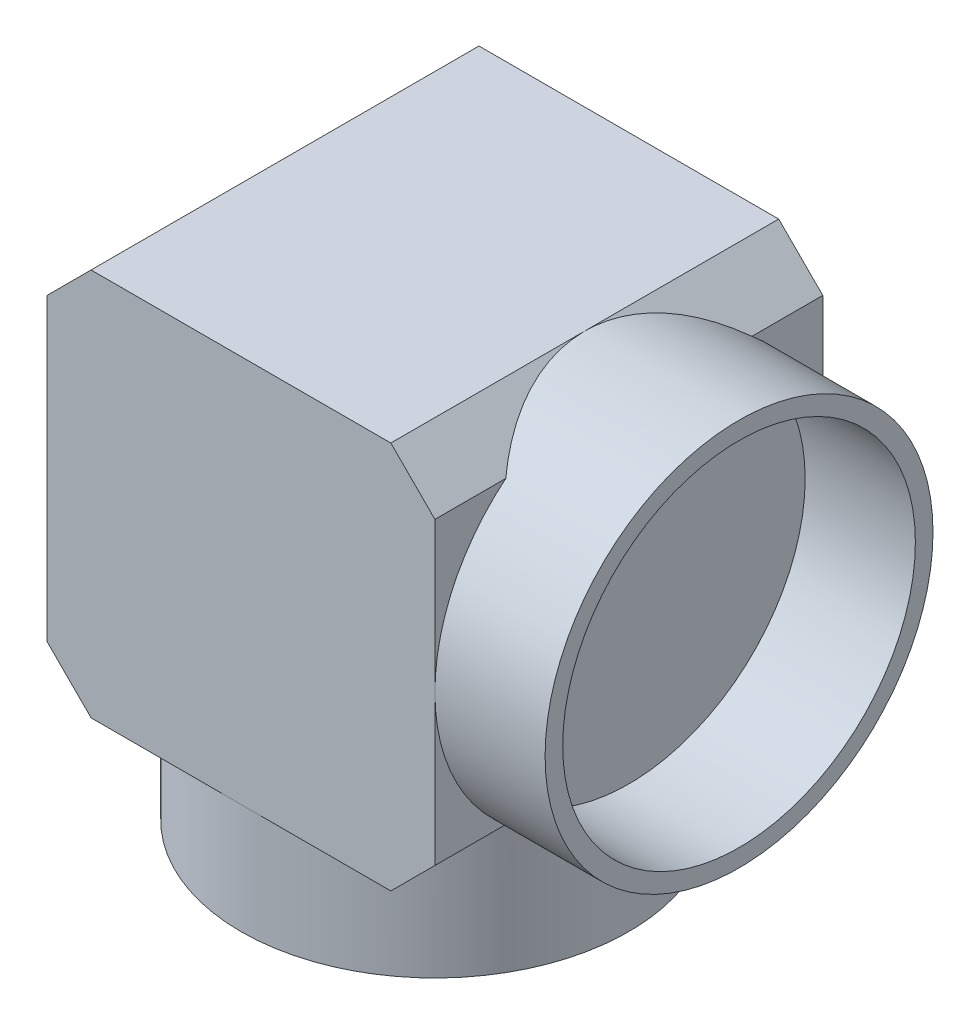
ISO-10303-21;
HEADER;
FILE_DESCRIPTION(('STEP AP214'),'2;1');
FILE_NAME('part.step','',(''),(''),'','','');
FILE_SCHEMA(('AUTOMOTIVE_DESIGN { 1 0 10303 214 1 1 1 1 }'));
ENDSEC;
DATA;
#1=APPLICATION_CONTEXT('core data for automotive mechanical design processes');
#2=APPLICATION_PROTOCOL_DEFINITION('international standard','automotive_design',2000,#1);
#3=PRODUCT_CONTEXT('',#1,'mechanical');
#4=PRODUCT('Part','Part','',(#3));
#5=PRODUCT_RELATED_PRODUCT_CATEGORY('part','',(#4));
#6=PRODUCT_DEFINITION_FORMATION('','',#4);
#7=PRODUCT_DEFINITION_CONTEXT('part definition',#1,'design');
#8=PRODUCT_DEFINITION('design','',#6,#7);
#9=PRODUCT_DEFINITION_SHAPE('','',#8);
#10=(LENGTH_UNIT() NAMED_UNIT(*) SI_UNIT(.MILLI.,.METRE.));
#11=(NAMED_UNIT(*) PLANE_ANGLE_UNIT() SI_UNIT($,.RADIAN.));
#12=(NAMED_UNIT(*) SI_UNIT($,.STERADIAN.) SOLID_ANGLE_UNIT());
#13=UNCERTAINTY_MEASURE_WITH_UNIT(LENGTH_MEASURE(1.E-05),#10,'distance_accuracy_value','');
#14=(GEOMETRIC_REPRESENTATION_CONTEXT(3) GLOBAL_UNCERTAINTY_ASSIGNED_CONTEXT((#13)) GLOBAL_UNIT_ASSIGNED_CONTEXT((#10,
#11,#12)) REPRESENTATION_CONTEXT('',''));
#15=CARTESIAN_POINT('',(0.,0.,0.));
#16=DIRECTION('',(0.,0.,1.));
#17=DIRECTION('',(1.,0.,0.));
#18=AXIS2_PLACEMENT_3D('',#15,#16,#17);
#19=CARTESIAN_POINT('',(44.,113.,44.));
#20=DIRECTION('',(-1.,0.,0.));
#21=DIRECTION('',(0.,0.,1.));
#22=AXIS2_PLACEMENT_3D('',#19,#20,#21);
#23=PLANE('',#22);
#24=DIRECTION('',(0.,-1.,0.));
#25=VECTOR('',#24,1.);
#26=CARTESIAN_POINT('',(44.,113.,44.));
#27=LINE('',#26,#25);
#28=CARTESIAN_POINT('',(44.,69.,44.));
#29=VERTEX_POINT('',#28);
#30=CARTESIAN_POINT('',(44.,35.0000000000002,44.));
#31=VERTEX_POINT('',#30);
#32=EDGE_CURVE('E170',#29,#31,#27,.T.);
#33=ORIENTED_EDGE('',*,*,#32,.T.);
#34=DIRECTION('',(0.,0.,-1.));
#35=VECTOR('',#34,1.);
#36=CARTESIAN_POINT('',(44.,35.0000000000002,44.));
#37=LINE('',#36,#35);
#38=CARTESIAN_POINT('',(44.,35.0000000000002,27.9284800875381));
#39=VERTEX_POINT('',#38);
#40=EDGE_CURVE('E181',#31,#39,#37,.T.);
#41=ORIENTED_EDGE('',*,*,#40,.T.);
#42=CARTESIAN_POINT('',(44.,69.,0.));
#43=DIRECTION('',(1.,0.,0.));
#44=DIRECTION('',(0.,0.,-1.));
#45=AXIS2_PLACEMENT_3D('',#42,#43,#44);
#46=CIRCLE('',#45,44.);
#47=EDGE_CURVE('E154',#29,#39,#46,.T.);
#48=ORIENTED_EDGE('',*,*,#47,.F.);
#49=EDGE_LOOP('',(#33,#41,#48));
#50=FACE_BOUND('',#49,.T.);
#51=ADVANCED_FACE('F41',(#50),#23,.F.);
#52=CARTESIAN_POINT('',(44.,35.0000000000002,-27.9284800875381));
#53=VERTEX_POINT('',#52);
#54=CARTESIAN_POINT('',(44.,69.,-44.));
#55=VERTEX_POINT('',#54);
#56=EDGE_CURVE('E161',#53,#55,#46,.T.);
#57=ORIENTED_EDGE('',*,*,#56,.F.);
#58=DIRECTION('',(0.,0.,-1.));
#59=VECTOR('',#58,1.);
#60=CARTESIAN_POINT('',(44.,35.0000000000002,44.));
#61=LINE('',#60,#59);
#62=CARTESIAN_POINT('',(44.,35.0000000000002,-44.));
#63=VERTEX_POINT('',#62);
#64=EDGE_CURVE('E337',#53,#63,#61,.T.);
#65=ORIENTED_EDGE('',*,*,#64,.T.);
#66=DIRECTION('',(0.,-1.,0.));
#67=VECTOR('',#66,1.);
#68=CARTESIAN_POINT('',(44.,113.,-44.));
#69=LINE('',#68,#67);
#70=EDGE_CURVE('E261',#55,#63,#69,.T.);
#71=ORIENTED_EDGE('',*,*,#70,.F.);
#72=EDGE_LOOP('',(#57,#65,#71));
#73=FACE_BOUND('',#72,.T.);
#74=ADVANCED_FACE('F220',(#73),#23,.F.);
#75=CARTESIAN_POINT('',(44.,103.,-44.));
#76=VERTEX_POINT('',#75);
#77=EDGE_CURVE('E180',#76,#55,#69,.T.);
#78=ORIENTED_EDGE('',*,*,#77,.F.);
#79=DIRECTION('',(0.,0.,1.));
#80=VECTOR('',#79,1.);
#81=CARTESIAN_POINT('',(44.,103.,0.));
#82=LINE('',#81,#80);
#83=CARTESIAN_POINT('',(44.,103.,-27.928480087538));
#84=VERTEX_POINT('',#83);
#85=EDGE_CURVE('E258',#76,#84,#82,.T.);
#86=ORIENTED_EDGE('',*,*,#85,.T.);
#87=EDGE_CURVE('E159',#55,#84,#46,.T.);
#88=ORIENTED_EDGE('',*,*,#87,.F.);
#89=EDGE_LOOP('',(#78,#86,#88));
#90=FACE_BOUND('',#89,.T.);
#91=ADVANCED_FACE('F225',(#90),#23,.F.);
#92=CARTESIAN_POINT('',(0.,0.,0.));
#93=DIRECTION('',(0.,1.,0.));
#94=DIRECTION('',(0.,0.,1.));
#95=AXIS2_PLACEMENT_3D('',#92,#93,#94);
#96=PLANE('',#95);
#97=CARTESIAN_POINT('',(0.,0.,0.));
#98=DIRECTION('',(0.,1.,0.));
#99=DIRECTION('',(0.,0.,1.));
#100=AXIS2_PLACEMENT_3D('',#97,#98,#99);
#101=CIRCLE('',#100,44.);
#102=CARTESIAN_POINT('',(0.,0.,44.));
#103=VERTEX_POINT('',#102);
#104=EDGE_CURVE('E319',#103,#103,#101,.T.);
#105=ORIENTED_EDGE('',*,*,#104,.F.);
#106=EDGE_LOOP('',(#105));
#107=FACE_BOUND('',#106,.T.);
#108=CARTESIAN_POINT('',(0.,0.,0.));
#109=DIRECTION('',(0.,1.,0.));
#110=DIRECTION('',(0.,0.,1.));
#111=AXIS2_PLACEMENT_3D('',#108,#109,#110);
#112=CIRCLE('',#111,40.);
#113=CARTESIAN_POINT('',(0.,0.,40.));
#114=VERTEX_POINT('',#113);
#115=EDGE_CURVE('E316',#114,#114,#112,.T.);
#116=ORIENTED_EDGE('',*,*,#115,.T.);
#117=EDGE_LOOP('',(#116));
#118=FACE_BOUND('',#117,.T.);
#119=ADVANCED_FACE('F248',(#107,#118),#96,.F.);
#120=CARTESIAN_POINT('',(0.,25.,0.));
#121=DIRECTION('',(0.,-1.,0.));
#122=DIRECTION('',(0.,0.,-1.));
#123=AXIS2_PLACEMENT_3D('',#120,#121,#122);
#124=CYLINDRICAL_SURFACE('',#123,44.);
#125=CARTESIAN_POINT('',(0.,25.,0.));
#126=DIRECTION('',(0.,1.,0.));
#127=DIRECTION('',(0.,0.,1.));
#128=AXIS2_PLACEMENT_3D('',#125,#126,#127);
#129=CIRCLE('',#128,44.);
#130=CARTESIAN_POINT('',(33.9999999999999,25.,-27.928480087538));
#131=VERTEX_POINT('',#130);
#132=CARTESIAN_POINT('',(0.,25.,-44.));
#133=VERTEX_POINT('',#132);
#134=EDGE_CURVE('E324',#131,#133,#129,.T.);
#135=ORIENTED_EDGE('',*,*,#134,.F.);
#136=CARTESIAN_POINT('',(0.,-9.00000000000025,0.));
#137=DIRECTION('',(-0.707106781186551,0.707106781186544,0.));
#138=DIRECTION('',(-0.707106781186544,-0.707106781186551,0.));
#139=AXIS2_PLACEMENT_3D('',#136,#137,#138);
#140=ELLIPSE('',#139,62.2253967444165,44.);
#141=CARTESIAN_POINT('',(38.9999999999999,30.0000000000001,-20.3715487874635));
#142=VERTEX_POINT('',#141);
#143=EDGE_CURVE('E279',#131,#142,#140,.F.);
#144=ORIENTED_EDGE('',*,*,#143,.T.);
#145=CARTESIAN_POINT('',(0.,69.,0.));
#146=DIRECTION('',(-0.707106781186547,-0.707106781186547,0.));
#147=DIRECTION('',(-0.707106781186547,0.707106781186547,0.));
#148=AXIS2_PLACEMENT_3D('',#145,#146,#147);
#149=ELLIPSE('',#148,62.2253967444162,44.);
#150=CARTESIAN_POINT('',(38.9999999999999,30.0000000000001,20.3715487874635));
#151=VERTEX_POINT('',#150);
#152=EDGE_CURVE('E11',#142,#151,#149,.T.);
#153=ORIENTED_EDGE('',*,*,#152,.T.);
#154=CARTESIAN_POINT('',(0.,-9.00000000000025,0.));
#155=DIRECTION('',(-0.707106781186551,0.707106781186544,0.));
#156=DIRECTION('',(-0.707106781186544,-0.707106781186551,0.));
#157=AXIS2_PLACEMENT_3D('',#154,#155,#156);
#158=ELLIPSE('',#157,62.2253967444165,44.);
#159=CARTESIAN_POINT('',(33.9999999999999,25.,27.928480087538));
#160=VERTEX_POINT('',#159);
#161=EDGE_CURVE('E277',#151,#160,#158,.F.);
#162=ORIENTED_EDGE('',*,*,#161,.T.);
#163=CARTESIAN_POINT('',(0.,25.,44.));
#164=VERTEX_POINT('',#163);
#165=EDGE_CURVE('E323',#164,#160,#129,.T.);
#166=ORIENTED_EDGE('',*,*,#165,.F.);
#167=CARTESIAN_POINT('',(-33.9999999999999,25.,27.928480087538));
#168=VERTEX_POINT('',#167);
#169=EDGE_CURVE('E320',#168,#164,#129,.T.);
#170=ORIENTED_EDGE('',*,*,#169,.F.);
#171=CARTESIAN_POINT('',(0.,-9.00000000000025,0.));
#172=DIRECTION('',(0.707106781186551,0.707106781186544,0.));
#173=DIRECTION('',(0.707106781186544,-0.707106781186551,0.));
#174=AXIS2_PLACEMENT_3D('',#171,#172,#173);
#175=ELLIPSE('',#174,62.2253967444165,44.);
#176=CARTESIAN_POINT('',(-44.,35.0000000000002,0.));
#177=VERTEX_POINT('',#176);
#178=EDGE_CURVE('E283',#168,#177,#175,.F.);
#179=ORIENTED_EDGE('',*,*,#178,.T.);
#180=CARTESIAN_POINT('',(0.,-9.00000000000025,0.));
#181=DIRECTION('',(0.707106781186551,0.707106781186544,0.));
#182=DIRECTION('',(0.707106781186544,-0.707106781186551,0.));
#183=AXIS2_PLACEMENT_3D('',#180,#181,#182);
#184=ELLIPSE('',#183,62.2253967444165,44.);
#185=CARTESIAN_POINT('',(-33.9999999999999,25.,-27.928480087538));
#186=VERTEX_POINT('',#185);
#187=EDGE_CURVE('E286',#177,#186,#184,.F.);
#188=ORIENTED_EDGE('',*,*,#187,.T.);
#189=EDGE_CURVE('E322',#133,#186,#129,.T.);
#190=ORIENTED_EDGE('',*,*,#189,.F.);
#191=EDGE_LOOP('',(#135,#144,#153,#162,#166,#170,#179,#188,#190));
#192=FACE_BOUND('',#191,.T.);
#193=ORIENTED_EDGE('',*,*,#104,.T.);
#194=EDGE_LOOP('',(#193));
#195=FACE_BOUND('',#194,.T.);
#196=ADVANCED_FACE('F253',(#192,#195),#124,.T.);
#197=CARTESIAN_POINT('',(0.,25.,0.));
#198=DIRECTION('',(0.,-1.,0.));
#199=DIRECTION('',(0.,0.,-1.));
#200=AXIS2_PLACEMENT_3D('',#197,#198,#199);
#201=CYLINDRICAL_SURFACE('',#200,40.);
#202=CARTESIAN_POINT('',(0.,25.,0.));
#203=DIRECTION('',(0.,1.,0.));
#204=DIRECTION('',(0.,0.,1.));
#205=AXIS2_PLACEMENT_3D('',#202,#203,#204);
#206=CIRCLE('',#205,40.);
#207=CARTESIAN_POINT('',(0.,25.,40.));
#208=VERTEX_POINT('',#207);
#209=EDGE_CURVE('E313',#208,#208,#206,.T.);
#210=ORIENTED_EDGE('',*,*,#209,.T.);
#211=EDGE_LOOP('',(#210));
#212=FACE_BOUND('',#211,.T.);
#213=ORIENTED_EDGE('',*,*,#115,.F.);
#214=EDGE_LOOP('',(#213));
#215=FACE_BOUND('',#214,.T.);
#216=ADVANCED_FACE('F399',(#212,#215),#201,.F.);
#217=CARTESIAN_POINT('',(0.,25.,0.));
#218=DIRECTION('',(0.,1.,0.));
#219=DIRECTION('',(0.,0.,1.));
#220=AXIS2_PLACEMENT_3D('',#217,#218,#219);
#221=PLANE('',#220);
#222=ORIENTED_EDGE('',*,*,#209,.F.);
#223=EDGE_LOOP('',(#222));
#224=FACE_BOUND('',#223,.T.);
#225=ADVANCED_FACE('F404',(#224),#221,.F.);
#226=DIRECTION('',(-1.,0.,0.));
#227=VECTOR('',#226,1.);
#228=CARTESIAN_POINT('',(44.,25.,-44.));
#229=LINE('',#228,#227);
#230=CARTESIAN_POINT('',(33.9999999999999,25.,-44.));
#231=VERTEX_POINT('',#230);
#232=EDGE_CURVE('E305',#231,#133,#229,.T.);
#233=ORIENTED_EDGE('',*,*,#232,.F.);
#234=DIRECTION('',(0.,0.,1.));
#235=VECTOR('',#234,1.);
#236=CARTESIAN_POINT('',(33.9999999999999,25.,0.));
#237=LINE('',#236,#235);
#238=EDGE_CURVE('E346',#231,#131,#237,.T.);
#239=ORIENTED_EDGE('',*,*,#238,.T.);
#240=ORIENTED_EDGE('',*,*,#134,.T.);
#241=EDGE_LOOP('',(#233,#239,#240));
#242=FACE_BOUND('',#241,.T.);
#243=ADVANCED_FACE('F421',(#242),#221,.F.);
#244=ORIENTED_EDGE('',*,*,#189,.T.);
#245=DIRECTION('',(0.,0.,-1.));
#246=VECTOR('',#245,1.);
#247=CARTESIAN_POINT('',(-33.9999999999999,25.,0.));
#248=LINE('',#247,#246);
#249=CARTESIAN_POINT('',(-33.9999999999999,25.,-44.));
#250=VERTEX_POINT('',#249);
#251=EDGE_CURVE('E357',#186,#250,#248,.T.);
#252=ORIENTED_EDGE('',*,*,#251,.T.);
#253=EDGE_CURVE('E308',#133,#250,#229,.T.);
#254=ORIENTED_EDGE('',*,*,#253,.F.);
#255=EDGE_LOOP('',(#244,#252,#254));
#256=FACE_BOUND('',#255,.T.);
#257=ADVANCED_FACE('F417',(#256),#221,.F.);
#258=DIRECTION('',(1.,0.,0.));
#259=VECTOR('',#258,1.);
#260=CARTESIAN_POINT('',(44.,25.,44.));
#261=LINE('',#260,#259);
#262=CARTESIAN_POINT('',(-33.9999999999999,25.,44.));
#263=VERTEX_POINT('',#262);
#264=EDGE_CURVE('E193',#263,#164,#261,.T.);
#265=ORIENTED_EDGE('',*,*,#264,.F.);
#266=DIRECTION('',(0.,0.,-1.));
#267=VECTOR('',#266,1.);
#268=CARTESIAN_POINT('',(-33.9999999999999,25.,0.));
#269=LINE('',#268,#267);
#270=EDGE_CURVE('E355',#263,#168,#269,.T.);
#271=ORIENTED_EDGE('',*,*,#270,.T.);
#272=ORIENTED_EDGE('',*,*,#169,.T.);
#273=EDGE_LOOP('',(#265,#271,#272));
#274=FACE_BOUND('',#273,.T.);
#275=ADVANCED_FACE('F411',(#274),#221,.F.);
#276=ORIENTED_EDGE('',*,*,#165,.T.);
#277=DIRECTION('',(0.,0.,1.));
#278=VECTOR('',#277,1.);
#279=CARTESIAN_POINT('',(33.9999999999999,25.,0.));
#280=LINE('',#279,#278);
#281=CARTESIAN_POINT('',(33.9999999999999,25.,44.));
#282=VERTEX_POINT('',#281);
#283=EDGE_CURVE('E328',#160,#282,#280,.T.);
#284=ORIENTED_EDGE('',*,*,#283,.T.);
#285=EDGE_CURVE('E190',#164,#282,#261,.T.);
#286=ORIENTED_EDGE('',*,*,#285,.F.);
#287=EDGE_LOOP('',(#276,#284,#286));
#288=FACE_BOUND('',#287,.T.);
#289=ADVANCED_FACE('F407',(#288),#221,.F.);
#290=CARTESIAN_POINT('',(-44.,113.,44.));
#291=DIRECTION('',(1.,0.,0.));
#292=DIRECTION('',(0.,0.,-1.));
#293=AXIS2_PLACEMENT_3D('',#290,#291,#292);
#294=PLANE('',#293);
#295=DIRECTION('',(0.,0.,1.));
#296=VECTOR('',#295,1.);
#297=CARTESIAN_POINT('',(-44.,35.0000000000002,44.));
#298=LINE('',#297,#296);
#299=CARTESIAN_POINT('',(-44.,35.0000000000002,-44.));
#300=VERTEX_POINT('',#299);
#301=EDGE_CURVE('E350',#300,#177,#298,.T.);
#302=ORIENTED_EDGE('',*,*,#301,.T.);
#303=DIRECTION('',(0.,0.,1.));
#304=VECTOR('',#303,1.);
#305=CARTESIAN_POINT('',(-44.,35.0000000000002,44.));
#306=LINE('',#305,#304);
#307=CARTESIAN_POINT('',(-44.,35.0000000000002,44.));
#308=VERTEX_POINT('',#307);
#309=EDGE_CURVE('E352',#177,#308,#306,.T.);
#310=ORIENTED_EDGE('',*,*,#309,.T.);
#311=DIRECTION('',(0.,-1.,0.));
#312=VECTOR('',#311,1.);
#313=CARTESIAN_POINT('',(-44.,113.,44.));
#314=LINE('',#313,#312);
#315=CARTESIAN_POINT('',(-44.,103.,44.));
#316=VERTEX_POINT('',#315);
#317=EDGE_CURVE('E169',#316,#308,#314,.T.);
#318=ORIENTED_EDGE('',*,*,#317,.F.);
#319=DIRECTION('',(0.,0.,-1.));
#320=VECTOR('',#319,1.);
#321=CARTESIAN_POINT('',(-44.,103.,-44.));
#322=LINE('',#321,#320);
#323=CARTESIAN_POINT('',(-44.,103.,-44.));
#324=VERTEX_POINT('',#323);
#325=EDGE_CURVE('E348',#316,#324,#322,.T.);
#326=ORIENTED_EDGE('',*,*,#325,.T.);
#327=DIRECTION('',(0.,-1.,0.));
#328=VECTOR('',#327,1.);
#329=CARTESIAN_POINT('',(-44.,113.,-44.));
#330=LINE('',#329,#328);
#331=EDGE_CURVE('E300',#324,#300,#330,.T.);
#332=ORIENTED_EDGE('',*,*,#331,.T.);
#333=EDGE_LOOP('',(#302,#310,#318,#326,#332));
#334=FACE_BOUND('',#333,.T.);
#335=ADVANCED_FACE('F236',(#334),#294,.F.);
#336=CARTESIAN_POINT('',(44.,113.,44.));
#337=DIRECTION('',(0.,0.,-1.));
#338=DIRECTION('',(-1.,0.,0.));
#339=AXIS2_PLACEMENT_3D('',#336,#337,#338);
#340=PLANE('',#339);
#341=ORIENTED_EDGE('',*,*,#285,.T.);
#342=DIRECTION('',(-0.707106781186544,-0.707106781186551,0.));
#343=VECTOR('',#342,1.);
#344=CARTESIAN_POINT('',(44.,35.0000000000002,44.));
#345=LINE('',#344,#343);
#346=EDGE_CURVE('E176',#282,#31,#345,.F.);
#347=ORIENTED_EDGE('',*,*,#346,.T.);
#348=ORIENTED_EDGE('',*,*,#32,.F.);
#349=CARTESIAN_POINT('',(44.,103.,44.));
#350=VERTEX_POINT('',#349);
#351=EDGE_CURVE('E163',#350,#29,#27,.T.);
#352=ORIENTED_EDGE('',*,*,#351,.F.);
#353=DIRECTION('',(-0.707106781186551,0.707106781186544,0.));
#354=VECTOR('',#353,1.);
#355=CARTESIAN_POINT('',(33.9999999999998,113.,44.));
#356=LINE('',#355,#354);
#357=CARTESIAN_POINT('',(33.9999999999998,113.,44.));
#358=VERTEX_POINT('',#357);
#359=EDGE_CURVE('E332',#350,#358,#356,.T.);
#360=ORIENTED_EDGE('',*,*,#359,.T.);
#361=DIRECTION('',(1.,0.,0.));
#362=VECTOR('',#361,1.);
#363=CARTESIAN_POINT('',(44.,113.,44.));
#364=LINE('',#363,#362);
#365=CARTESIAN_POINT('',(-34.,113.,44.));
#366=VERTEX_POINT('',#365);
#367=EDGE_CURVE('E301',#366,#358,#364,.T.);
#368=ORIENTED_EDGE('',*,*,#367,.F.);
#369=DIRECTION('',(-0.707106781186546,-0.707106781186549,0.));
#370=VECTOR('',#369,1.);
#371=CARTESIAN_POINT('',(-34.,113.,44.));
#372=LINE('',#371,#370);
#373=EDGE_CURVE('E330',#366,#316,#372,.T.);
#374=ORIENTED_EDGE('',*,*,#373,.T.);
#375=ORIENTED_EDGE('',*,*,#317,.T.);
#376=DIRECTION('',(-0.707106781186544,0.707106781186551,0.));
#377=VECTOR('',#376,1.);
#378=CARTESIAN_POINT('',(-44.,35.0000000000002,44.));
#379=LINE('',#378,#377);
#380=EDGE_CURVE('E334',#308,#263,#379,.F.);
#381=ORIENTED_EDGE('',*,*,#380,.T.);
#382=ORIENTED_EDGE('',*,*,#264,.T.);
#383=EDGE_LOOP('',(#341,#347,#348,#352,#360,#368,#374,#375,#381,#382));
#384=FACE_BOUND('',#383,.T.);
#385=ADVANCED_FACE('F174',(#384),#340,.F.);
#386=CARTESIAN_POINT('',(44.,103.,27.928480087538));
#387=VERTEX_POINT('',#386);
#388=EDGE_CURVE('E149',#387,#29,#46,.T.);
#389=ORIENTED_EDGE('',*,*,#388,.F.);
#390=DIRECTION('',(0.,0.,1.));
#391=VECTOR('',#390,1.);
#392=CARTESIAN_POINT('',(44.,103.,44.));
#393=LINE('',#392,#391);
#394=EDGE_CURVE('E166',#387,#350,#393,.T.);
#395=ORIENTED_EDGE('',*,*,#394,.T.);
#396=ORIENTED_EDGE('',*,*,#351,.T.);
#397=EDGE_LOOP('',(#389,#395,#396));
#398=FACE_BOUND('',#397,.T.);
#399=ADVANCED_FACE('F165',(#398),#23,.F.);
#400=CARTESIAN_POINT('',(44.,113.,-44.));
#401=DIRECTION('',(0.,0.,1.));
#402=DIRECTION('',(1.,0.,0.));
#403=AXIS2_PLACEMENT_3D('',#400,#401,#402);
#404=PLANE('',#403);
#405=ORIENTED_EDGE('',*,*,#70,.T.);
#406=DIRECTION('',(0.707106781186544,0.707106781186551,0.));
#407=VECTOR('',#406,1.);
#408=CARTESIAN_POINT('',(44.,35.0000000000002,-44.));
#409=LINE('',#408,#407);
#410=EDGE_CURVE('E344',#63,#231,#409,.F.);
#411=ORIENTED_EDGE('',*,*,#410,.T.);
#412=ORIENTED_EDGE('',*,*,#232,.T.);
#413=ORIENTED_EDGE('',*,*,#253,.T.);
#414=DIRECTION('',(0.707106781186544,-0.707106781186551,0.));
#415=VECTOR('',#414,1.);
#416=CARTESIAN_POINT('',(-44.,35.0000000000002,-44.));
#417=LINE('',#416,#415);
#418=EDGE_CURVE('E342',#250,#300,#417,.F.);
#419=ORIENTED_EDGE('',*,*,#418,.T.);
#420=ORIENTED_EDGE('',*,*,#331,.F.);
#421=DIRECTION('',(0.707106781186546,0.707106781186549,0.));
#422=VECTOR('',#421,1.);
#423=CARTESIAN_POINT('',(-34.,113.,-44.));
#424=LINE('',#423,#422);
#425=CARTESIAN_POINT('',(-34.,113.,-44.));
#426=VERTEX_POINT('',#425);
#427=EDGE_CURVE('E299',#324,#426,#424,.T.);
#428=ORIENTED_EDGE('',*,*,#427,.T.);
#429=DIRECTION('',(-1.,0.,0.));
#430=VECTOR('',#429,1.);
#431=CARTESIAN_POINT('',(44.,113.,-44.));
#432=LINE('',#431,#430);
#433=CARTESIAN_POINT('',(33.9999999999998,113.,-44.));
#434=VERTEX_POINT('',#433);
#435=EDGE_CURVE('E294',#434,#426,#432,.T.);
#436=ORIENTED_EDGE('',*,*,#435,.F.);
#437=DIRECTION('',(0.707106781186551,-0.707106781186544,0.));
#438=VECTOR('',#437,1.);
#439=CARTESIAN_POINT('',(33.9999999999998,113.,-44.));
#440=LINE('',#439,#438);
#441=EDGE_CURVE('E266',#434,#76,#440,.T.);
#442=ORIENTED_EDGE('',*,*,#441,.T.);
#443=ORIENTED_EDGE('',*,*,#77,.T.);
#444=EDGE_LOOP('',(#405,#411,#412,#413,#419,#420,#428,#436,#442,#443));
#445=FACE_BOUND('',#444,.T.);
#446=ADVANCED_FACE('F215',(#445),#404,.F.);
#447=CARTESIAN_POINT('',(0.,113.,0.));
#448=DIRECTION('',(0.,1.,0.));
#449=DIRECTION('',(0.,0.,1.));
#450=AXIS2_PLACEMENT_3D('',#447,#448,#449);
#451=PLANE('',#450);
#452=DIRECTION('',(0.,0.,-1.));
#453=VECTOR('',#452,1.);
#454=CARTESIAN_POINT('',(33.9999999999998,113.,0.));
#455=LINE('',#454,#453);
#456=CARTESIAN_POINT('',(33.9999999999998,113.,0.));
#457=VERTEX_POINT('',#456);
#458=EDGE_CURVE('E272',#358,#457,#455,.T.);
#459=ORIENTED_EDGE('',*,*,#458,.T.);
#460=DIRECTION('',(0.,0.,-1.));
#461=VECTOR('',#460,1.);
#462=CARTESIAN_POINT('',(33.9999999999998,113.,-44.));
#463=LINE('',#462,#461);
#464=EDGE_CURVE('E269',#457,#434,#463,.T.);
#465=ORIENTED_EDGE('',*,*,#464,.T.);
#466=ORIENTED_EDGE('',*,*,#435,.T.);
#467=DIRECTION('',(0.,0.,1.));
#468=VECTOR('',#467,1.);
#469=CARTESIAN_POINT('',(-34.,113.,44.));
#470=LINE('',#469,#468);
#471=EDGE_CURVE('E359',#426,#366,#470,.T.);
#472=ORIENTED_EDGE('',*,*,#471,.T.);
#473=ORIENTED_EDGE('',*,*,#367,.T.);
#474=EDGE_LOOP('',(#459,#465,#466,#472,#473));
#475=FACE_BOUND('',#474,.T.);
#476=ADVANCED_FACE('F207',(#475),#451,.T.);
#477=CARTESIAN_POINT('',(69.,69.,0.));
#478=DIRECTION('',(1.,0.,0.));
#479=DIRECTION('',(0.,0.,-1.));
#480=AXIS2_PLACEMENT_3D('',#477,#478,#479);
#481=PLANE('',#480);
#482=CARTESIAN_POINT('',(69.,69.,0.));
#483=DIRECTION('',(1.,0.,0.));
#484=DIRECTION('',(0.,0.,-1.));
#485=AXIS2_PLACEMENT_3D('',#482,#483,#484);
#486=CIRCLE('',#485,44.);
#487=CARTESIAN_POINT('',(69.,69.,-44.));
#488=VERTEX_POINT('',#487);
#489=EDGE_CURVE('E186',#488,#488,#486,.T.);
#490=ORIENTED_EDGE('',*,*,#489,.T.);
#491=EDGE_LOOP('',(#490));
#492=FACE_BOUND('',#491,.T.);
#493=CARTESIAN_POINT('',(69.,69.,0.));
#494=DIRECTION('',(1.,0.,0.));
#495=DIRECTION('',(0.,0.,-1.));
#496=AXIS2_PLACEMENT_3D('',#493,#494,#495);
#497=CIRCLE('',#496,40.);
#498=CARTESIAN_POINT('',(69.,69.,-40.));
#499=VERTEX_POINT('',#498);
#500=EDGE_CURVE('E183',#499,#499,#497,.T.);
#501=ORIENTED_EDGE('',*,*,#500,.F.);
#502=EDGE_LOOP('',(#501));
#503=FACE_BOUND('',#502,.T.);
#504=ADVANCED_FACE('F205',(#492,#503),#481,.T.);
#505=CARTESIAN_POINT('',(69.,69.,0.));
#506=DIRECTION('',(-1.,0.,0.));
#507=DIRECTION('',(0.,0.,1.));
#508=AXIS2_PLACEMENT_3D('',#505,#506,#507);
#509=CYLINDRICAL_SURFACE('',#508,44.);
#510=ORIENTED_EDGE('',*,*,#489,.F.);
#511=EDGE_LOOP('',(#510));
#512=FACE_BOUND('',#511,.T.);
#513=ORIENTED_EDGE('',*,*,#87,.T.);
#514=CARTESIAN_POINT('',(78.0000000000003,69.,0.));
#515=DIRECTION('',(0.707106781186544,0.707106781186551,0.));
#516=DIRECTION('',(-0.707106781186551,0.707106781186544,0.));
#517=AXIS2_PLACEMENT_3D('',#514,#515,#516);
#518=ELLIPSE('',#517,62.2253967444165,44.);
#519=EDGE_CURVE('E268',#84,#457,#518,.T.);
#520=ORIENTED_EDGE('',*,*,#519,.T.);
#521=CARTESIAN_POINT('',(78.0000000000003,69.,0.));
#522=DIRECTION('',(0.707106781186544,0.707106781186551,0.));
#523=DIRECTION('',(-0.707106781186551,0.707106781186544,0.));
#524=AXIS2_PLACEMENT_3D('',#521,#522,#523);
#525=ELLIPSE('',#524,62.2253967444165,44.);
#526=EDGE_CURVE('E50',#457,#387,#525,.T.);
#527=ORIENTED_EDGE('',*,*,#526,.T.);
#528=ORIENTED_EDGE('',*,*,#388,.T.);
#529=ORIENTED_EDGE('',*,*,#47,.T.);
#530=CARTESIAN_POINT('',(77.9999999999995,69.,0.));
#531=DIRECTION('',(-0.707106781186551,0.707106781186544,0.));
#532=DIRECTION('',(-0.707106781186544,-0.707106781186551,0.));
#533=AXIS2_PLACEMENT_3D('',#530,#531,#532);
#534=ELLIPSE('',#533,62.2253967444159,44.);
#535=EDGE_CURVE('E60',#39,#151,#534,.F.);
#536=ORIENTED_EDGE('',*,*,#535,.T.);
#537=ORIENTED_EDGE('',*,*,#152,.F.);
#538=CARTESIAN_POINT('',(77.9999999999995,69.,0.));
#539=DIRECTION('',(-0.707106781186551,0.707106781186544,0.));
#540=DIRECTION('',(-0.707106781186544,-0.707106781186551,0.));
#541=AXIS2_PLACEMENT_3D('',#538,#539,#540);
#542=ELLIPSE('',#541,62.2253967444159,44.);
#543=EDGE_CURVE('E281',#142,#53,#542,.F.);
#544=ORIENTED_EDGE('',*,*,#543,.T.);
#545=ORIENTED_EDGE('',*,*,#56,.T.);
#546=EDGE_LOOP('',(#513,#520,#527,#528,#529,#536,#537,#544,#545));
#547=FACE_BOUND('',#546,.T.);
#548=ADVANCED_FACE('F152',(#512,#547),#509,.T.);
#549=CARTESIAN_POINT('',(69.,69.,0.));
#550=DIRECTION('',(-1.,0.,0.));
#551=DIRECTION('',(0.,0.,1.));
#552=AXIS2_PLACEMENT_3D('',#549,#550,#551);
#553=CYLINDRICAL_SURFACE('',#552,40.);
#554=ORIENTED_EDGE('',*,*,#500,.T.);
#555=EDGE_LOOP('',(#554));
#556=FACE_BOUND('',#555,.T.);
#557=CARTESIAN_POINT('',(44.,69.,0.));
#558=DIRECTION('',(1.,0.,0.));
#559=DIRECTION('',(0.,0.,-1.));
#560=AXIS2_PLACEMENT_3D('',#557,#558,#559);
#561=CIRCLE('',#560,40.);
#562=CARTESIAN_POINT('',(44.,69.,-40.));
#563=VERTEX_POINT('',#562);
#564=EDGE_CURVE('E196',#563,#563,#561,.T.);
#565=ORIENTED_EDGE('',*,*,#564,.F.);
#566=EDGE_LOOP('',(#565));
#567=FACE_BOUND('',#566,.T.);
#568=ADVANCED_FACE('F202',(#556,#567),#553,.F.);
#569=ORIENTED_EDGE('',*,*,#564,.T.);
#570=EDGE_LOOP('',(#569));
#571=FACE_BOUND('',#570,.T.);
#572=ADVANCED_FACE('F230',(#571),#23,.F.);
#573=CARTESIAN_POINT('',(44.,35.0000000000002,44.));
#574=DIRECTION('',(-0.707106781186551,0.707106781186544,0.));
#575=DIRECTION('',(0.,0.,-1.));
#576=AXIS2_PLACEMENT_3D('',#573,#574,#575);
#577=PLANE('',#576);
#578=ORIENTED_EDGE('',*,*,#346,.F.);
#579=ORIENTED_EDGE('',*,*,#283,.F.);
#580=ORIENTED_EDGE('',*,*,#161,.F.);
#581=ORIENTED_EDGE('',*,*,#535,.F.);
#582=ORIENTED_EDGE('',*,*,#40,.F.);
#583=EDGE_LOOP('',(#578,#579,#580,#581,#582));
#584=FACE_BOUND('',#583,.T.);
#585=ADVANCED_FACE('F238',(#584),#577,.F.);
#586=CARTESIAN_POINT('',(44.,35.0000000000002,44.));
#587=DIRECTION('',(-0.707106781186551,0.707106781186544,0.));
#588=DIRECTION('',(0.,0.,-1.));
#589=AXIS2_PLACEMENT_3D('',#586,#587,#588);
#590=PLANE('',#589);
#591=ORIENTED_EDGE('',*,*,#143,.F.);
#592=ORIENTED_EDGE('',*,*,#238,.F.);
#593=ORIENTED_EDGE('',*,*,#410,.F.);
#594=ORIENTED_EDGE('',*,*,#64,.F.);
#595=ORIENTED_EDGE('',*,*,#543,.F.);
#596=EDGE_LOOP('',(#591,#592,#593,#594,#595));
#597=FACE_BOUND('',#596,.T.);
#598=ADVANCED_FACE('F244',(#597),#590,.F.);
#599=CARTESIAN_POINT('',(-44.,35.0000000000002,44.));
#600=DIRECTION('',(0.707106781186551,0.707106781186544,0.));
#601=DIRECTION('',(0.,0.,1.));
#602=AXIS2_PLACEMENT_3D('',#599,#600,#601);
#603=PLANE('',#602);
#604=ORIENTED_EDGE('',*,*,#251,.F.);
#605=ORIENTED_EDGE('',*,*,#187,.F.);
#606=ORIENTED_EDGE('',*,*,#301,.F.);
#607=ORIENTED_EDGE('',*,*,#418,.F.);
#608=EDGE_LOOP('',(#604,#605,#606,#607));
#609=FACE_BOUND('',#608,.T.);
#610=ADVANCED_FACE('F381',(#609),#603,.F.);
#611=CARTESIAN_POINT('',(-44.,35.0000000000002,44.));
#612=DIRECTION('',(0.707106781186551,0.707106781186544,0.));
#613=DIRECTION('',(0.,0.,1.));
#614=AXIS2_PLACEMENT_3D('',#611,#612,#613);
#615=PLANE('',#614);
#616=ORIENTED_EDGE('',*,*,#178,.F.);
#617=ORIENTED_EDGE('',*,*,#270,.F.);
#618=ORIENTED_EDGE('',*,*,#380,.F.);
#619=ORIENTED_EDGE('',*,*,#309,.F.);
#620=EDGE_LOOP('',(#616,#617,#618,#619));
#621=FACE_BOUND('',#620,.T.);
#622=ADVANCED_FACE('F374',(#621),#615,.F.);
#623=CARTESIAN_POINT('',(33.9999999999998,113.,0.));
#624=DIRECTION('',(0.707106781186544,0.707106781186551,0.));
#625=DIRECTION('',(0.,0.,1.));
#626=AXIS2_PLACEMENT_3D('',#623,#624,#625);
#627=PLANE('',#626);
#628=ORIENTED_EDGE('',*,*,#394,.F.);
#629=ORIENTED_EDGE('',*,*,#526,.F.);
#630=ORIENTED_EDGE('',*,*,#458,.F.);
#631=ORIENTED_EDGE('',*,*,#359,.F.);
#632=EDGE_LOOP('',(#628,#629,#630,#631));
#633=FACE_BOUND('',#632,.T.);
#634=ADVANCED_FACE('F290',(#633),#627,.T.);
#635=CARTESIAN_POINT('',(33.9999999999998,113.,0.));
#636=DIRECTION('',(0.707106781186544,0.707106781186551,0.));
#637=DIRECTION('',(0.,0.,1.));
#638=AXIS2_PLACEMENT_3D('',#635,#636,#637);
#639=PLANE('',#638);
#640=ORIENTED_EDGE('',*,*,#519,.F.);
#641=ORIENTED_EDGE('',*,*,#85,.F.);
#642=ORIENTED_EDGE('',*,*,#441,.F.);
#643=ORIENTED_EDGE('',*,*,#464,.F.);
#644=EDGE_LOOP('',(#640,#641,#642,#643));
#645=FACE_BOUND('',#644,.T.);
#646=ADVANCED_FACE('F264',(#645),#639,.T.);
#647=CARTESIAN_POINT('',(-34.,113.,0.));
#648=DIRECTION('',(-0.707106781186549,0.707106781186545,0.));
#649=DIRECTION('',(0.,0.,-1.));
#650=AXIS2_PLACEMENT_3D('',#647,#648,#649);
#651=PLANE('',#650);
#652=ORIENTED_EDGE('',*,*,#427,.F.);
#653=ORIENTED_EDGE('',*,*,#325,.F.);
#654=ORIENTED_EDGE('',*,*,#373,.F.);
#655=ORIENTED_EDGE('',*,*,#471,.F.);
#656=EDGE_LOOP('',(#652,#653,#654,#655));
#657=FACE_BOUND('',#656,.T.);
#658=ADVANCED_FACE('F44',(#657),#651,.T.);
#659=CLOSED_SHELL('',(#51,#74,#91,#119,#196,#216,#225,#243,#257,#275,#289,#335,#385,#399,#446,
#476,#504,#548,#568,#572,#585,#598,#610,#622,#634,#646,#658));
#660=MANIFOLD_SOLID_BREP('B2',#659);
#661=ADVANCED_BREP_SHAPE_REPRESENTATION('',(#18,#660),#14);
#662=SHAPE_DEFINITION_REPRESENTATION(#9,#661);
ENDSEC;
END-ISO-10303-21;
